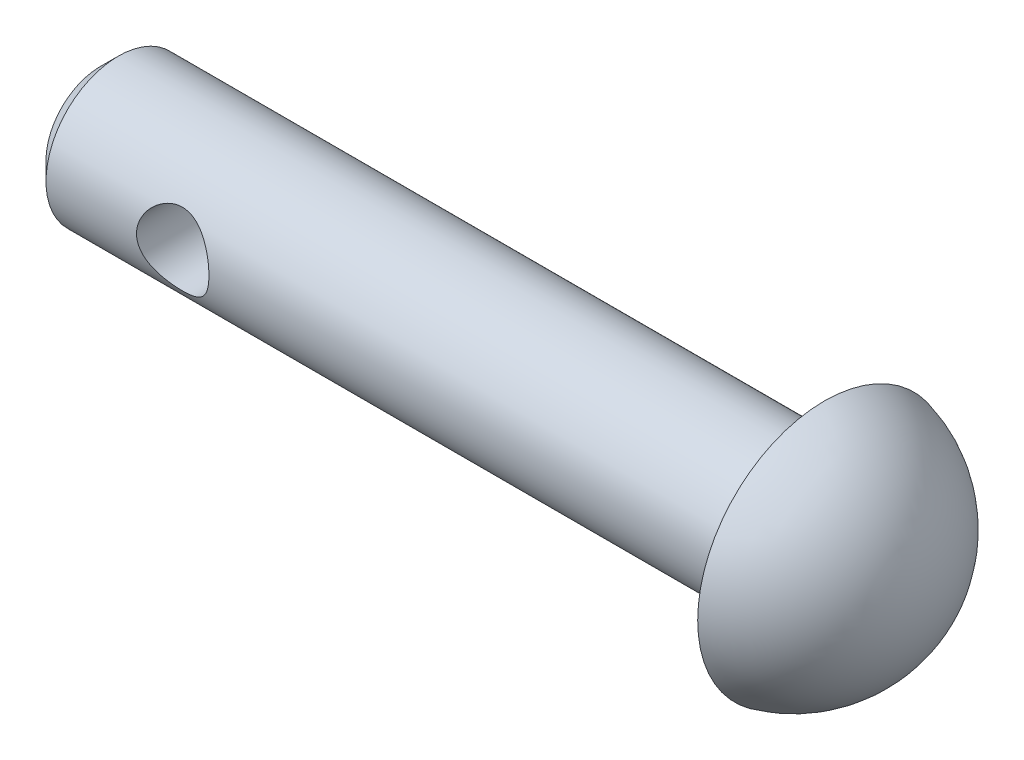
ISO-10303-21;
HEADER;
FILE_DESCRIPTION(('STEP AP214'),'2;1');
FILE_NAME('part.step','',(''),(''),'','','');
FILE_SCHEMA(('AUTOMOTIVE_DESIGN { 1 0 10303 214 1 1 1 1 }'));
ENDSEC;
DATA;
#1=APPLICATION_CONTEXT('core data for automotive mechanical design processes');
#2=APPLICATION_PROTOCOL_DEFINITION('international standard','automotive_design',2000,#1);
#3=PRODUCT_CONTEXT('',#1,'mechanical');
#4=PRODUCT('Part','Part','',(#3));
#5=PRODUCT_RELATED_PRODUCT_CATEGORY('part','',(#4));
#6=PRODUCT_DEFINITION_FORMATION('','',#4);
#7=PRODUCT_DEFINITION_CONTEXT('part definition',#1,'design');
#8=PRODUCT_DEFINITION('design','',#6,#7);
#9=PRODUCT_DEFINITION_SHAPE('','',#8);
#10=(LENGTH_UNIT() NAMED_UNIT(*) SI_UNIT(.MILLI.,.METRE.));
#11=(NAMED_UNIT(*) PLANE_ANGLE_UNIT() SI_UNIT($,.RADIAN.));
#12=(NAMED_UNIT(*) SI_UNIT($,.STERADIAN.) SOLID_ANGLE_UNIT());
#13=UNCERTAINTY_MEASURE_WITH_UNIT(LENGTH_MEASURE(1.E-05),#10,'distance_accuracy_value','');
#14=(GEOMETRIC_REPRESENTATION_CONTEXT(3) GLOBAL_UNCERTAINTY_ASSIGNED_CONTEXT((#13)) GLOBAL_UNIT_ASSIGNED_CONTEXT((#10,
#11,#12)) REPRESENTATION_CONTEXT('',''));
#15=CARTESIAN_POINT('',(0.,0.,0.));
#16=DIRECTION('',(0.,0.,1.));
#17=DIRECTION('',(1.,0.,0.));
#18=AXIS2_PLACEMENT_3D('',#15,#16,#17);
#19=CARTESIAN_POINT('',(-20.,0.,0.));
#20=DIRECTION('',(1.,0.,0.));
#21=DIRECTION('',(0.,0.,-1.));
#22=AXIS2_PLACEMENT_3D('',#19,#20,#21);
#23=CYLINDRICAL_SURFACE('',#22,2.);
#24=CARTESIAN_POINT('',(-19.5,0.,0.));
#25=DIRECTION('',(1.,0.,0.));
#26=DIRECTION('',(0.,0.,-1.));
#27=AXIS2_PLACEMENT_3D('',#24,#25,#26);
#28=CIRCLE('',#27,2.);
#29=CARTESIAN_POINT('',(-19.5,0.,-2.));
#30=VERTEX_POINT('',#29);
#31=EDGE_CURVE('E38',#30,#30,#28,.T.);
#32=ORIENTED_EDGE('',*,*,#31,.T.);
#33=EDGE_LOOP('',(#32));
#34=FACE_BOUND('',#33,.T.);
#35=CARTESIAN_POINT('',(-15.,0.,-2.));
#36=CARTESIAN_POINT('',(-15.0000033023195,-0.0525719629529865,-1.99999713404151));
#37=CARTESIAN_POINT('',(-15.0041700731217,-0.105206599698033,-1.99790491019518));
#38=CARTESIAN_POINT('',(-15.0206528803409,-0.208920235268425,-1.98974156037396));
#39=CARTESIAN_POINT('',(-15.0329843929976,-0.259996086713504,-1.98366287828984));
#40=CARTESIAN_POINT('',(-15.0651938086168,-0.358933544880575,-1.96816279403312));
#41=CARTESIAN_POINT('',(-15.085042384248,-0.406806802939181,-1.9587543917752));
#42=CARTESIAN_POINT('',(-15.1315706213649,-0.498472616806566,-1.93745776515779));
#43=CARTESIAN_POINT('',(-15.1582497442489,-0.54226549399005,-1.9255697363353));
#44=CARTESIAN_POINT('',(-15.2195172494853,-0.62750781776192,-1.89956258258057));
#45=CARTESIAN_POINT('',(-15.2544864792396,-0.668655211122113,-1.88535199127536));
#46=CARTESIAN_POINT('',(-15.330521479247,-0.744779444866978,-1.85659970246744));
#47=CARTESIAN_POINT('',(-15.3715918517724,-0.779751583106767,-1.84205776209035));
#48=CARTESIAN_POINT('',(-15.4624833495234,-0.84525200045028,-1.81298951197347));
#49=CARTESIAN_POINT('',(-15.5127360983459,-0.875225335551638,-1.79855186970132));
#50=CARTESIAN_POINT('',(-15.6183673359862,-0.926168226890696,-1.77285978772321));
#51=CARTESIAN_POINT('',(-15.6737421287227,-0.947144214966335,-1.7616030760699));
#52=CARTESIAN_POINT('',(-15.7846651054219,-0.97813244218859,-1.74457867037808));
#53=CARTESIAN_POINT('',(-15.8400044520674,-0.988725857080443,-1.73852271583713));
#54=CARTESIAN_POINT('',(-15.9519788377795,-1.00042699330885,-1.73181889948528));
#55=CARTESIAN_POINT('',(-16.0086125408712,-1.00154408837308,-1.73116569343288));
#56=CARTESIAN_POINT('',(-16.1142860243154,-0.994687287172296,-1.73510930257248));
#57=CARTESIAN_POINT('',(-16.163424031223,-0.987784559536823,-1.73908763662013));
#58=CARTESIAN_POINT('',(-16.259721909373,-0.966939849056935,-1.7507622873385));
#59=CARTESIAN_POINT('',(-16.3068811453053,-0.952995623897654,-1.75845978831776));
#60=CARTESIAN_POINT('',(-16.3992291325657,-0.918209780386006,-1.77687476412741));
#61=CARTESIAN_POINT('',(-16.4443463987858,-0.897215067115997,-1.78765840663998));
#62=CARTESIAN_POINT('',(-16.53063429259,-0.849041687668004,-1.81103404281404));
#63=CARTESIAN_POINT('',(-16.5718031356001,-0.821860243812469,-1.8236268478019));
#64=CARTESIAN_POINT('',(-16.6545212527432,-0.75806605491279,-1.85113157903286));
#65=CARTESIAN_POINT('',(-16.6954568735762,-0.720694458369283,-1.86613510236746));
#66=CARTESIAN_POINT('',(-16.7707354185909,-0.639555578741374,-1.89547623300407));
#67=CARTESIAN_POINT('',(-16.8050751920339,-0.595785256574287,-1.90981351958801));
#68=CARTESIAN_POINT('',(-16.8676856610297,-0.50051650583185,-1.93701987282964));
#69=CARTESIAN_POINT('',(-16.8956004724457,-0.448753591599411,-1.94978984162007));
#70=CARTESIAN_POINT('',(-16.942097029043,-0.340466215488799,-1.97157881121242));
#71=CARTESIAN_POINT('',(-16.9606861850152,-0.283945576265279,-1.98060078943553));
#72=CARTESIAN_POINT('',(-16.9864754037167,-0.172766491660705,-1.99324333741436));
#73=CARTESIAN_POINT('',(-16.9944912357468,-0.118341530548327,-1.99724938301312));
#74=CARTESIAN_POINT('',(-17.0014647311345,-0.00877959994935651,-2.00073013459102));
#75=CARTESIAN_POINT('',(-17.0004266856395,0.0463570198698988,-2.00020698721312));
#76=CARTESIAN_POINT('',(-16.9897933115812,0.151232971985991,-1.99491192253441));
#77=CARTESIAN_POINT('',(-16.98086746727,0.201059408049952,-1.9904724568819));
#78=CARTESIAN_POINT('',(-16.9557619281049,0.298406892301915,-1.97822171314819));
#79=CARTESIAN_POINT('',(-16.9395814335466,0.345927685690995,-1.97041006334332));
#80=CARTESIAN_POINT('',(-16.9000015335668,0.438888608449664,-1.95184251413669));
#81=CARTESIAN_POINT('',(-16.8764089498832,0.484230397006153,-1.94100881769939));
#82=CARTESIAN_POINT('',(-16.822892464354,0.570461361698921,-1.91743974317109));
#83=CARTESIAN_POINT('',(-16.7929658654066,0.611348629775281,-1.90470355565785));
#84=CARTESIAN_POINT('',(-16.7242395746671,0.691767689290653,-1.87708221337464));
#85=CARTESIAN_POINT('',(-16.6848571315464,0.730772077824639,-1.86210884848441));
#86=CARTESIAN_POINT('',(-16.6000748487307,0.80185632111324,-1.83262391603874));
#87=CARTESIAN_POINT('',(-16.5546708811836,0.833931385690841,-1.81811267381526));
#88=CARTESIAN_POINT('',(-16.4563563457997,0.891707914497694,-1.79051192226068));
#89=CARTESIAN_POINT('',(-16.4031887337914,0.917025495878636,-1.77752529663472));
#90=CARTESIAN_POINT('',(-16.2924899323075,0.958082826013803,-1.75574072368126));
#91=CARTESIAN_POINT('',(-16.2349644734988,0.97383491588757,-1.74693738240618));
#92=CARTESIAN_POINT('',(-16.1230897771386,0.99386168744968,-1.73561501008667));
#93=CARTESIAN_POINT('',(-16.068965746571,0.999092996400866,-1.73257383460491));
#94=CARTESIAN_POINT('',(-15.9605529328293,1.00068915438079,-1.73165354646175));
#95=CARTESIAN_POINT('',(-15.9062642312606,0.997057846624401,-1.73377219627552));
#96=CARTESIAN_POINT('',(-15.804516498468,0.981926125592265,-1.74237862050025));
#97=CARTESIAN_POINT('',(-15.7568995298556,0.971208314342801,-1.74843094482394));
#98=CARTESIAN_POINT('',(-15.6641918805753,0.943175358224647,-1.76371016187917));
#99=CARTESIAN_POINT('',(-15.619102017908,0.925858091159812,-1.77293807569675));
#100=CARTESIAN_POINT('',(-15.5293751490134,0.883815745300685,-1.79428530364528));
#101=CARTESIAN_POINT('',(-15.4849720981703,0.85867113781646,-1.8065572239619));
#102=CARTESIAN_POINT('',(-15.4007254638194,0.802150971636636,-1.8323533163459));
#103=CARTESIAN_POINT('',(-15.3608842694815,0.77077217123865,-1.84587813794522));
#104=CARTESIAN_POINT('',(-15.2818580176424,0.698203326664643,-1.87462323159313));
#105=CARTESIAN_POINT('',(-15.2433408976381,0.656284423010173,-1.88984983311469));
#106=CARTESIAN_POINT('',(-15.1737370165764,0.566154806220281,-1.91877752255088));
#107=CARTESIAN_POINT('',(-15.1426542605737,0.517940723256786,-1.9324777860804));
#108=CARTESIAN_POINT('',(-15.0887636372378,0.415931596819949,-1.95698009585103));
#109=CARTESIAN_POINT('',(-15.0660158305886,0.362099503934616,-1.96776096562909));
#110=CARTESIAN_POINT('',(-15.030191832081,0.250742101294193,-1.98501341363465));
#111=CARTESIAN_POINT('',(-15.0170881531704,0.193227799623168,-1.99149723372932));
#112=CARTESIAN_POINT('',(-15.0061025889241,0.112601946483386,-1.99695461909663));
#113=CARTESIAN_POINT('',(-15.0038173591364,0.0901618794395003,-1.99809365339202));
#114=CARTESIAN_POINT('',(-15.0007653344832,0.0451517318071585,-1.99961696977865));
#115=CARTESIAN_POINT('',(-14.9999985815288,0.0225816476473818,-2.00000123103763));
#116=CARTESIAN_POINT('',(-15.,0.,-2.));
#117=B_SPLINE_CURVE_WITH_KNOTS('',3,(#35,#36,#37,#38,#39,#40,#41,#42,#43,#44,#45,#46,#47,#48,
#49,#50,#51,#52,#53,#54,#55,#56,#57,#58,#59,#60,#61,#62,#63,#64,#65,#66,#67,#68,#69,#70,#71,#72,
#73,#74,#75,#76,#77,#78,#79,#80,#81,#82,#83,#84,#85,#86,#87,#88,#89,#90,#91,#92,#93,#94,#95,#96,
#97,#98,#99,#100,#101,#102,#103,#104,#105,#106,#107,#108,#109,#110,#111,#112,#113,#114,#115,
#116),.UNSPECIFIED.,.T.,.F.,(4,2,2,2,2,2,2,2,2,2,2,2,2,2,2,2,2,2,2,2,2,2,2,2,2,2,2,2,2,2,2,2,2,
2,2,2,2,2,2,2,4),(0.,0.157624257420293,0.315548149709198,0.472862155492299,0.630163760581568,
0.79698175871809,0.963926237654036,1.14381726430753,1.32357947898281,1.4925801214023,
1.6614135732902,1.8100571240932,1.95874803925678,2.11090240168487,2.26312521260222,
2.43464941333879,2.60625534598687,2.78583022214441,2.9652621691228,3.12983290471346,
3.29432564511476,3.44606906506122,3.59782921630932,3.75392856027899,3.9100945074834,
4.08159610644419,4.25321588615432,4.43314682159674,4.61284511940778,4.77529307498374,
4.93767059860006,5.08457930244183,5.23153528783678,5.38836456775615,5.54527561138958,
5.72125242752499,5.89732383376573,6.07464013662926,6.25144908624931,6.31915280137698,
6.38685838514848),.UNSPECIFIED.);
#118=CARTESIAN_POINT('',(-15.,0.,-2.));
#119=VERTEX_POINT('',#118);
#120=EDGE_CURVE('E42',#119,#119,#117,.T.);
#121=ORIENTED_EDGE('',*,*,#120,.F.);
#122=EDGE_LOOP('',(#121));
#123=FACE_BOUND('',#122,.T.);
#124=CARTESIAN_POINT('',(-15.,0.,2.));
#125=CARTESIAN_POINT('',(-15.0000033023195,0.0525719629529865,1.99999713404151));
#126=CARTESIAN_POINT('',(-15.0041700731217,0.105206599698033,1.99790491019518));
#127=CARTESIAN_POINT('',(-15.0206528803409,0.208920235268425,1.98974156037396));
#128=CARTESIAN_POINT('',(-15.0329843929976,0.259996086713504,1.98366287828984));
#129=CARTESIAN_POINT('',(-15.0651938086168,0.358933544880575,1.96816279403312));
#130=CARTESIAN_POINT('',(-15.085042384248,0.406806802939181,1.9587543917752));
#131=CARTESIAN_POINT('',(-15.1315706213649,0.498472616806566,1.93745776515779));
#132=CARTESIAN_POINT('',(-15.1582497442489,0.54226549399005,1.9255697363353));
#133=CARTESIAN_POINT('',(-15.2195172494853,0.62750781776192,1.89956258258057));
#134=CARTESIAN_POINT('',(-15.2544864792396,0.668655211122113,1.88535199127536));
#135=CARTESIAN_POINT('',(-15.330521479247,0.744779444866978,1.85659970246744));
#136=CARTESIAN_POINT('',(-15.3715918517724,0.779751583106767,1.84205776209035));
#137=CARTESIAN_POINT('',(-15.4624833495234,0.84525200045028,1.81298951197347));
#138=CARTESIAN_POINT('',(-15.5127360983459,0.875225335551638,1.79855186970132));
#139=CARTESIAN_POINT('',(-15.6183673359862,0.926168226890696,1.77285978772321));
#140=CARTESIAN_POINT('',(-15.6737421287227,0.947144214966335,1.7616030760699));
#141=CARTESIAN_POINT('',(-15.7846651054219,0.97813244218859,1.74457867037808));
#142=CARTESIAN_POINT('',(-15.8400044520674,0.988725857080443,1.73852271583713));
#143=CARTESIAN_POINT('',(-15.9519788377795,1.00042699330885,1.73181889948528));
#144=CARTESIAN_POINT('',(-16.0086125408712,1.00154408837308,1.73116569343288));
#145=CARTESIAN_POINT('',(-16.1142860243154,0.994687287172296,1.73510930257248));
#146=CARTESIAN_POINT('',(-16.163424031223,0.987784559536823,1.73908763662013));
#147=CARTESIAN_POINT('',(-16.259721909373,0.966939849056935,1.7507622873385));
#148=CARTESIAN_POINT('',(-16.3068811453053,0.952995623897654,1.75845978831776));
#149=CARTESIAN_POINT('',(-16.3992291325657,0.918209780386006,1.77687476412741));
#150=CARTESIAN_POINT('',(-16.4443463987858,0.897215067115997,1.78765840663998));
#151=CARTESIAN_POINT('',(-16.53063429259,0.849041687668004,1.81103404281404));
#152=CARTESIAN_POINT('',(-16.5718031356001,0.821860243812469,1.8236268478019));
#153=CARTESIAN_POINT('',(-16.6545212527432,0.75806605491279,1.85113157903286));
#154=CARTESIAN_POINT('',(-16.6954568735762,0.720694458369283,1.86613510236746));
#155=CARTESIAN_POINT('',(-16.7707354185909,0.639555578741374,1.89547623300407));
#156=CARTESIAN_POINT('',(-16.8050751920339,0.595785256574287,1.90981351958801));
#157=CARTESIAN_POINT('',(-16.8676856610297,0.50051650583185,1.93701987282964));
#158=CARTESIAN_POINT('',(-16.8956004724457,0.448753591599411,1.94978984162007));
#159=CARTESIAN_POINT('',(-16.942097029043,0.340466215488799,1.97157881121242));
#160=CARTESIAN_POINT('',(-16.9606861850152,0.283945576265279,1.98060078943553));
#161=CARTESIAN_POINT('',(-16.9864754037167,0.172766491660705,1.99324333741436));
#162=CARTESIAN_POINT('',(-16.9944912357468,0.118341530548327,1.99724938301312));
#163=CARTESIAN_POINT('',(-17.0014647311345,0.00877959994935651,2.00073013459102));
#164=CARTESIAN_POINT('',(-17.0004266856395,-0.0463570198698988,2.00020698721312));
#165=CARTESIAN_POINT('',(-16.9897933115812,-0.151232971985991,1.99491192253441));
#166=CARTESIAN_POINT('',(-16.98086746727,-0.201059408049952,1.9904724568819));
#167=CARTESIAN_POINT('',(-16.9557619281049,-0.298406892301915,1.97822171314819));
#168=CARTESIAN_POINT('',(-16.9395814335466,-0.345927685690995,1.97041006334332));
#169=CARTESIAN_POINT('',(-16.9000015335668,-0.438888608449664,1.95184251413669));
#170=CARTESIAN_POINT('',(-16.8764089498832,-0.484230397006153,1.94100881769939));
#171=CARTESIAN_POINT('',(-16.822892464354,-0.570461361698921,1.91743974317109));
#172=CARTESIAN_POINT('',(-16.7929658654066,-0.611348629775281,1.90470355565785));
#173=CARTESIAN_POINT('',(-16.7242395746671,-0.691767689290653,1.87708221337464));
#174=CARTESIAN_POINT('',(-16.6848571315464,-0.730772077824639,1.86210884848441));
#175=CARTESIAN_POINT('',(-16.6000748487307,-0.80185632111324,1.83262391603874));
#176=CARTESIAN_POINT('',(-16.5546708811836,-0.833931385690841,1.81811267381526));
#177=CARTESIAN_POINT('',(-16.4563563457997,-0.891707914497694,1.79051192226068));
#178=CARTESIAN_POINT('',(-16.4031887337914,-0.917025495878636,1.77752529663472));
#179=CARTESIAN_POINT('',(-16.2924899323075,-0.958082826013803,1.75574072368126));
#180=CARTESIAN_POINT('',(-16.2349644734988,-0.97383491588757,1.74693738240618));
#181=CARTESIAN_POINT('',(-16.1230897771386,-0.99386168744968,1.73561501008667));
#182=CARTESIAN_POINT('',(-16.068965746571,-0.999092996400866,1.73257383460491));
#183=CARTESIAN_POINT('',(-15.9605529328293,-1.00068915438079,1.73165354646175));
#184=CARTESIAN_POINT('',(-15.9062642312606,-0.997057846624401,1.73377219627552));
#185=CARTESIAN_POINT('',(-15.804516498468,-0.981926125592265,1.74237862050025));
#186=CARTESIAN_POINT('',(-15.7568995298556,-0.971208314342801,1.74843094482394));
#187=CARTESIAN_POINT('',(-15.6641918805753,-0.943175358224647,1.76371016187917));
#188=CARTESIAN_POINT('',(-15.619102017908,-0.925858091159812,1.77293807569675));
#189=CARTESIAN_POINT('',(-15.5293751490134,-0.883815745300685,1.79428530364528));
#190=CARTESIAN_POINT('',(-15.4849720981703,-0.85867113781646,1.8065572239619));
#191=CARTESIAN_POINT('',(-15.4007254638194,-0.802150971636636,1.8323533163459));
#192=CARTESIAN_POINT('',(-15.3608842694815,-0.77077217123865,1.84587813794522));
#193=CARTESIAN_POINT('',(-15.2818580176424,-0.698203326664643,1.87462323159313));
#194=CARTESIAN_POINT('',(-15.2433408976381,-0.656284423010173,1.88984983311469));
#195=CARTESIAN_POINT('',(-15.1737370165764,-0.566154806220281,1.91877752255088));
#196=CARTESIAN_POINT('',(-15.1426542605737,-0.517940723256786,1.9324777860804));
#197=CARTESIAN_POINT('',(-15.0887636372378,-0.415931596819949,1.95698009585103));
#198=CARTESIAN_POINT('',(-15.0660158305886,-0.362099503934616,1.96776096562909));
#199=CARTESIAN_POINT('',(-15.030191832081,-0.250742101294193,1.98501341363465));
#200=CARTESIAN_POINT('',(-15.0170881531704,-0.193227799623168,1.99149723372932));
#201=CARTESIAN_POINT('',(-15.0061025889241,-0.112601946483386,1.99695461909663));
#202=CARTESIAN_POINT('',(-15.0038173591364,-0.0901618794395003,1.99809365339202));
#203=CARTESIAN_POINT('',(-15.0007653344832,-0.0451517318071585,1.99961696977865));
#204=CARTESIAN_POINT('',(-14.9999985815288,-0.0225816476473818,2.00000123103763));
#205=CARTESIAN_POINT('',(-15.,0.,2.));
#206=B_SPLINE_CURVE_WITH_KNOTS('',3,(#124,#125,#126,#127,#128,#129,#130,#131,#132,#133,#134,
#135,#136,#137,#138,#139,#140,#141,#142,#143,#144,#145,#146,#147,#148,#149,#150,#151,#152,#153,
#154,#155,#156,#157,#158,#159,#160,#161,#162,#163,#164,#165,#166,#167,#168,#169,#170,#171,#172,
#173,#174,#175,#176,#177,#178,#179,#180,#181,#182,#183,#184,#185,#186,#187,#188,#189,#190,#191,
#192,#193,#194,#195,#196,#197,#198,#199,#200,#201,#202,#203,#204,#205),.UNSPECIFIED.,.T.,.F.,(4,
2,2,2,2,2,2,2,2,2,2,2,2,2,2,2,2,2,2,2,2,2,2,2,2,2,2,2,2,2,2,2,2,2,2,2,2,2,2,2,4),(0.,
0.157624257420293,0.315548149709198,0.472862155492299,0.630163760581568,0.79698175871809,
0.963926237654036,1.14381726430753,1.32357947898281,1.4925801214023,1.6614135732902,
1.8100571240932,1.95874803925678,2.11090240168487,2.26312521260222,2.43464941333879,
2.60625534598687,2.78583022214441,2.9652621691228,3.12983290471346,3.29432564511476,
3.44606906506122,3.59782921630932,3.75392856027899,3.9100945074834,4.08159610644419,
4.25321588615432,4.43314682159674,4.61284511940778,4.77529307498374,4.93767059860006,
5.08457930244183,5.23153528783678,5.38836456775615,5.54527561138958,5.72125242752499,
5.89732383376573,6.07464013662926,6.25144908624931,6.31915280137698,6.38685838514848),.UNSPECIFIED.);
#207=CARTESIAN_POINT('',(-15.,0.,2.));
#208=VERTEX_POINT('',#207);
#209=EDGE_CURVE('E46',#208,#208,#206,.T.);
#210=ORIENTED_EDGE('',*,*,#209,.F.);
#211=EDGE_LOOP('',(#210));
#212=FACE_BOUND('',#211,.T.);
#213=CARTESIAN_POINT('',(0.,0.,0.));
#214=DIRECTION('',(1.,0.,0.));
#215=DIRECTION('',(0.,0.,-1.));
#216=AXIS2_PLACEMENT_3D('',#213,#214,#215);
#217=CIRCLE('',#216,2.);
#218=CARTESIAN_POINT('',(0.,0.,-2.));
#219=VERTEX_POINT('',#218);
#220=EDGE_CURVE('E80',#219,#219,#217,.T.);
#221=ORIENTED_EDGE('',*,*,#220,.F.);
#222=EDGE_LOOP('',(#221));
#223=FACE_BOUND('',#222,.T.);
#224=ADVANCED_FACE('F31',(#34,#123,#212,#223),#23,.T.);
#225=CARTESIAN_POINT('',(-20.,0.,0.));
#226=DIRECTION('',(1.,0.,0.));
#227=DIRECTION('',(0.,0.,-1.));
#228=AXIS2_PLACEMENT_3D('',#225,#226,#227);
#229=PLANE('',#228);
#230=CARTESIAN_POINT('',(-20.,0.,0.));
#231=DIRECTION('',(1.,0.,0.));
#232=DIRECTION('',(0.,0.,-1.));
#233=AXIS2_PLACEMENT_3D('',#230,#231,#232);
#234=CIRCLE('',#233,1.49999999999999);
#235=CARTESIAN_POINT('',(-20.,0.,-1.49999999999999));
#236=VERTEX_POINT('',#235);
#237=EDGE_CURVE('E10',#236,#236,#234,.F.);
#238=ORIENTED_EDGE('',*,*,#237,.T.);
#239=EDGE_LOOP('',(#238));
#240=FACE_BOUND('',#239,.T.);
#241=ADVANCED_FACE('F61',(#240),#229,.F.);
#242=CARTESIAN_POINT('',(-16.,0.,-2.));
#243=DIRECTION('',(0.,0.,1.));
#244=DIRECTION('',(1.,0.,0.));
#245=AXIS2_PLACEMENT_3D('',#242,#243,#244);
#246=CYLINDRICAL_SURFACE('',#245,1.);
#247=ORIENTED_EDGE('',*,*,#120,.T.);
#248=EDGE_LOOP('',(#247));
#249=FACE_BOUND('',#248,.T.);
#250=ORIENTED_EDGE('',*,*,#209,.T.);
#251=EDGE_LOOP('',(#250));
#252=FACE_BOUND('',#251,.T.);
#253=ADVANCED_FACE('F57',(#249,#252),#246,.F.);
#254=CARTESIAN_POINT('',(-19.5,0.,0.));
#255=DIRECTION('',(1.,0.,0.));
#256=DIRECTION('',(0.,0.,-1.));
#257=AXIS2_PLACEMENT_3D('',#254,#255,#256);
#258=CONICAL_SURFACE('',#257,2.,0.785398163397452);
#259=ORIENTED_EDGE('',*,*,#237,.F.);
#260=EDGE_LOOP('',(#259));
#261=FACE_BOUND('',#260,.T.);
#262=ORIENTED_EDGE('',*,*,#31,.F.);
#263=EDGE_LOOP('',(#262));
#264=FACE_BOUND('',#263,.T.);
#265=ADVANCED_FACE('F33',(#261,#264),#258,.T.);
#266=CARTESIAN_POINT('',(-0.842614977317635,0.,0.));
#267=DIRECTION('',(-1.,0.,0.));
#268=DIRECTION('',(0.,0.,-1.));
#269=AXIS2_PLACEMENT_3D('',#266,#267,#268);
#270=SPHERICAL_SURFACE('',#269,3.6);
#271=CARTESIAN_POINT('',(0.,0.,0.));
#272=DIRECTION('',(-1.,0.,0.));
#273=DIRECTION('',(0.,0.,1.));
#274=AXIS2_PLACEMENT_3D('',#271,#272,#273);
#275=CIRCLE('',#274,3.5);
#276=CARTESIAN_POINT('',(0.,0.,3.5));
#277=VERTEX_POINT('',#276);
#278=EDGE_CURVE('E82',#277,#277,#275,.T.);
#279=ORIENTED_EDGE('',*,*,#278,.F.);
#280=EDGE_LOOP('',(#279));
#281=FACE_BOUND('',#280,.T.);
#282=ADVANCED_FACE('F63',(#281),#270,.T.);
#283=CARTESIAN_POINT('',(0.,0.,-3.5));
#284=DIRECTION('',(1.,0.,0.));
#285=DIRECTION('',(0.,0.,-1.));
#286=AXIS2_PLACEMENT_3D('',#283,#284,#285);
#287=PLANE('',#286);
#288=ORIENTED_EDGE('',*,*,#220,.T.);
#289=EDGE_LOOP('',(#288));
#290=FACE_BOUND('',#289,.T.);
#291=ORIENTED_EDGE('',*,*,#278,.T.);
#292=EDGE_LOOP('',(#291));
#293=FACE_BOUND('',#292,.T.);
#294=ADVANCED_FACE('F87',(#290,#293),#287,.F.);
#295=CLOSED_SHELL('',(#224,#241,#253,#265,#282,#294));
#296=MANIFOLD_SOLID_BREP('B2',#295);
#297=ADVANCED_BREP_SHAPE_REPRESENTATION('',(#18,#296),#14);
#298=SHAPE_DEFINITION_REPRESENTATION(#9,#297);
ENDSEC;
END-ISO-10303-21;
